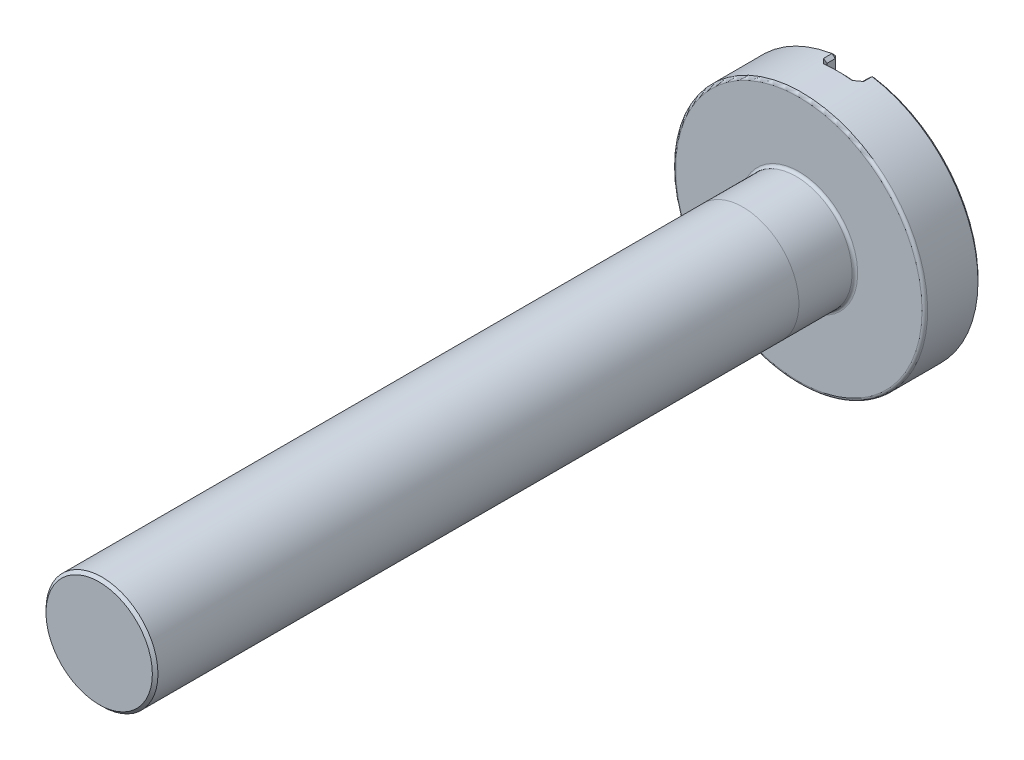
ISO-10303-21;
HEADER;
FILE_DESCRIPTION(('STEP AP214'),'2;1');
FILE_NAME('part.step','',(''),(''),'','','');
FILE_SCHEMA(('AUTOMOTIVE_DESIGN { 1 0 10303 214 1 1 1 1 }'));
ENDSEC;
DATA;
#1=APPLICATION_CONTEXT('core data for automotive mechanical design processes');
#2=APPLICATION_PROTOCOL_DEFINITION('international standard','automotive_design',2000,#1);
#3=PRODUCT_CONTEXT('',#1,'mechanical');
#4=PRODUCT('Part','Part','',(#3));
#5=PRODUCT_RELATED_PRODUCT_CATEGORY('part','',(#4));
#6=PRODUCT_DEFINITION_FORMATION('','',#4);
#7=PRODUCT_DEFINITION_CONTEXT('part definition',#1,'design');
#8=PRODUCT_DEFINITION('design','',#6,#7);
#9=PRODUCT_DEFINITION_SHAPE('','',#8);
#10=(LENGTH_UNIT() NAMED_UNIT(*) SI_UNIT(.MILLI.,.METRE.));
#11=(NAMED_UNIT(*) PLANE_ANGLE_UNIT() SI_UNIT($,.RADIAN.));
#12=(NAMED_UNIT(*) SI_UNIT($,.STERADIAN.) SOLID_ANGLE_UNIT());
#13=UNCERTAINTY_MEASURE_WITH_UNIT(LENGTH_MEASURE(1.E-05),#10,'distance_accuracy_value','');
#14=(GEOMETRIC_REPRESENTATION_CONTEXT(3) GLOBAL_UNCERTAINTY_ASSIGNED_CONTEXT((#13)) GLOBAL_UNIT_ASSIGNED_CONTEXT((#10,
#11,#12)) REPRESENTATION_CONTEXT('',''));
#15=CARTESIAN_POINT('',(0.,0.,0.));
#16=DIRECTION('',(0.,0.,1.));
#17=DIRECTION('',(1.,0.,0.));
#18=AXIS2_PLACEMENT_3D('',#15,#16,#17);
#19=CARTESIAN_POINT('',(0.,0.,125.));
#20=DIRECTION('',(0.,0.,-1.));
#21=DIRECTION('',(-1.,0.,0.));
#22=AXIS2_PLACEMENT_3D('',#19,#20,#21);
#23=CYLINDRICAL_SURFACE('',#22,10.);
#24=CARTESIAN_POINT('',(0.,0.,124.5));
#25=DIRECTION('',(0.,0.,1.));
#26=DIRECTION('',(1.,0.,0.));
#27=AXIS2_PLACEMENT_3D('',#24,#25,#26);
#28=CIRCLE('',#27,10.);
#29=CARTESIAN_POINT('',(10.,0.,124.5));
#30=VERTEX_POINT('',#29);
#31=EDGE_CURVE('E59',#30,#30,#28,.F.);
#32=ORIENTED_EDGE('',*,*,#31,.T.);
#33=EDGE_LOOP('',(#32));
#34=FACE_BOUND('',#33,.T.);
#35=CARTESIAN_POINT('',(0.,0.,9.99999999999999));
#36=DIRECTION('',(0.,0.,-1.));
#37=DIRECTION('',(-1.,0.,0.));
#38=AXIS2_PLACEMENT_3D('',#35,#36,#37);
#39=CIRCLE('',#38,10.);
#40=CARTESIAN_POINT('',(-10.,0.,10.));
#41=VERTEX_POINT('',#40);
#42=EDGE_CURVE('E11',#41,#41,#39,.T.);
#43=ORIENTED_EDGE('',*,*,#42,.F.);
#44=EDGE_LOOP('',(#43));
#45=FACE_BOUND('',#44,.T.);
#46=ADVANCED_FACE('F49',(#34,#45),#23,.T.);
#47=CARTESIAN_POINT('',(0.,0.,-10.));
#48=DIRECTION('',(0.,0.,1.));
#49=DIRECTION('',(1.,0.,0.));
#50=AXIS2_PLACEMENT_3D('',#47,#48,#49);
#51=CYLINDRICAL_SURFACE('',#50,22.5);
#52=CARTESIAN_POINT('',(0.,0.,-0.5));
#53=DIRECTION('',(0.,0.,-1.));
#54=DIRECTION('',(-1.,0.,0.));
#55=AXIS2_PLACEMENT_3D('',#52,#53,#54);
#56=CIRCLE('',#55,22.5);
#57=CARTESIAN_POINT('',(-22.5,0.,-0.5));
#58=VERTEX_POINT('',#57);
#59=EDGE_CURVE('E215',#58,#58,#56,.T.);
#60=ORIENTED_EDGE('',*,*,#59,.T.);
#61=EDGE_LOOP('',(#60));
#62=FACE_BOUND('',#61,.T.);
#63=CARTESIAN_POINT('',(3.57954545454546,-22.2134385978138,-8.));
#64=CARTESIAN_POINT('',(3.49044313577254,-22.2277959220937,-7.91081725524473));
#65=CARTESIAN_POINT('',(3.40106008970911,-22.2416500607058,-7.82183310951024));
#66=CARTESIAN_POINT('',(3.22168315908927,-22.2683406364463,-7.64432903282822));
#67=CARTESIAN_POINT('',(3.13168927393446,-22.2811770725775,-7.55580910233561));
#68=CARTESIAN_POINT('',(2.88093679969333,-22.3153844989665,-7.31080236996562));
#69=CARTESIAN_POINT('',(2.71946710818321,-22.3356468320787,-7.15488807871374));
#70=CARTESIAN_POINT('',(2.55681818181818,-22.3542541988124,-7.));
#71=B_SPLINE_CURVE_WITH_KNOTS('',3,(#63,#64,#65,#66,#67,#68,#69,#70),.UNSPECIFIED.,.F.,.F.,(4,2,
2,4),(0.,0.380643972705646,0.76128831836308,1.43736873556686),.UNSPECIFIED.);
#72=CARTESIAN_POINT('',(3.57954545454546,-22.2134385978138,-8.));
#73=VERTEX_POINT('',#72);
#74=CARTESIAN_POINT('',(2.55681818181818,-22.3542541988124,-7.));
#75=VERTEX_POINT('',#74);
#76=EDGE_CURVE('E345',#73,#75,#71,.T.);
#77=ORIENTED_EDGE('',*,*,#76,.F.);
#78=DIRECTION('',(0.,0.,1.));
#79=VECTOR('',#78,1.);
#80=CARTESIAN_POINT('',(3.57954545454546,-22.2134385978138,-10.));
#81=LINE('',#80,#79);
#82=CARTESIAN_POINT('',(3.57954545454546,-22.2134385978138,-9.5));
#83=VERTEX_POINT('',#82);
#84=EDGE_CURVE('E355',#73,#83,#81,.F.);
#85=ORIENTED_EDGE('',*,*,#84,.T.);
#86=CARTESIAN_POINT('',(0.,0.,-9.5));
#87=DIRECTION('',(0.,0.,-1.));
#88=DIRECTION('',(-1.,0.,0.));
#89=AXIS2_PLACEMENT_3D('',#86,#87,#88);
#90=CIRCLE('',#89,22.5);
#91=CARTESIAN_POINT('',(3.57954545454546,22.2134385978138,-9.5));
#92=VERTEX_POINT('',#91);
#93=EDGE_CURVE('E991',#83,#92,#90,.F.);
#94=ORIENTED_EDGE('',*,*,#93,.T.);
#95=DIRECTION('',(0.,0.,1.));
#96=VECTOR('',#95,1.);
#97=CARTESIAN_POINT('',(3.57954545454546,22.2134385978138,-10.));
#98=LINE('',#97,#96);
#99=CARTESIAN_POINT('',(3.57954545454546,22.2134385978138,-8.));
#100=VERTEX_POINT('',#99);
#101=EDGE_CURVE('E315',#92,#100,#98,.T.);
#102=ORIENTED_EDGE('',*,*,#101,.T.);
#103=CARTESIAN_POINT('',(2.55681818181818,22.3542541988124,-7.));
#104=CARTESIAN_POINT('',(2.64839427943384,22.3437790052845,-7.0871979694395));
#105=CARTESIAN_POINT('',(2.73959417329936,22.3327784719102,-7.17472569925024));
#106=CARTESIAN_POINT('',(2.92129371731404,22.309738799071,-7.35036917762152));
#107=CARTESIAN_POINT('',(3.01179336862716,22.297699661333,-7.43848492520419));
#108=CARTESIAN_POINT('',(3.26213414849512,22.2628523492319,-7.68382417251602));
#109=CARTESIAN_POINT('',(3.42127740145585,22.2389382114136,-7.84160444996238));
#110=CARTESIAN_POINT('',(3.57954545454546,22.2134385978138,-8.));
#111=B_SPLINE_CURVE_WITH_KNOTS('',3,(#103,#104,#105,#106,#107,#108,#109,#110),.UNSPECIFIED.,.F.,
.F.,(4,2,2,4),(0.,0.380645508799851,0.761290384745394,1.43736997086085),.UNSPECIFIED.);
#112=CARTESIAN_POINT('',(2.55681818181818,22.3542541988124,-7.));
#113=VERTEX_POINT('',#112);
#114=EDGE_CURVE('E307',#113,#100,#111,.T.);
#115=ORIENTED_EDGE('',*,*,#114,.F.);
#116=CARTESIAN_POINT('',(0.,0.,-7.));
#117=DIRECTION('',(0.,0.,1.));
#118=DIRECTION('',(1.,0.,0.));
#119=AXIS2_PLACEMENT_3D('',#116,#117,#118);
#120=CIRCLE('',#119,22.5);
#121=CARTESIAN_POINT('',(-2.55681818181818,22.3542541988124,-7.));
#122=VERTEX_POINT('',#121);
#123=EDGE_CURVE('E292',#113,#122,#120,.T.);
#124=ORIENTED_EDGE('',*,*,#123,.T.);
#125=CARTESIAN_POINT('',(-3.57954545454546,22.2134385978138,-8.));
#126=CARTESIAN_POINT('',(-3.49044313577254,22.2277959220937,-7.91081725524473));
#127=CARTESIAN_POINT('',(-3.4010600897091,22.2416500607058,-7.82183310951024));
#128=CARTESIAN_POINT('',(-3.22168315908927,22.2683406364463,-7.64432903282822));
#129=CARTESIAN_POINT('',(-3.13168927393446,22.2811770725775,-7.55580910233561));
#130=CARTESIAN_POINT('',(-2.88093679969333,22.3153844989665,-7.31080236996562));
#131=CARTESIAN_POINT('',(-2.7194671081832,22.3356468320787,-7.15488807871374));
#132=CARTESIAN_POINT('',(-2.55681818181818,22.3542541988124,-7.));
#133=B_SPLINE_CURVE_WITH_KNOTS('',3,(#125,#126,#127,#128,#129,#130,#131,#132),.UNSPECIFIED.,.F.,
.F.,(4,2,2,4),(0.,0.380643972705646,0.76128831836308,1.43736873556686),.UNSPECIFIED.);
#134=CARTESIAN_POINT('',(-3.57954545454546,22.2134385978138,-8.));
#135=VERTEX_POINT('',#134);
#136=EDGE_CURVE('E160',#135,#122,#133,.T.);
#137=ORIENTED_EDGE('',*,*,#136,.F.);
#138=DIRECTION('',(0.,0.,1.));
#139=VECTOR('',#138,1.);
#140=CARTESIAN_POINT('',(-3.57954545454546,22.2134385978138,-10.));
#141=LINE('',#140,#139);
#142=CARTESIAN_POINT('',(-3.57954545454546,22.2134385978138,-9.5));
#143=VERTEX_POINT('',#142);
#144=EDGE_CURVE('E154',#135,#143,#141,.F.);
#145=ORIENTED_EDGE('',*,*,#144,.T.);
#146=CARTESIAN_POINT('',(0.,0.,-9.5));
#147=DIRECTION('',(0.,0.,-1.));
#148=DIRECTION('',(-1.,0.,0.));
#149=AXIS2_PLACEMENT_3D('',#146,#147,#148);
#150=CIRCLE('',#149,22.5);
#151=CARTESIAN_POINT('',(-3.57954545454546,-22.2134385978138,-9.5));
#152=VERTEX_POINT('',#151);
#153=EDGE_CURVE('E157',#143,#152,#150,.F.);
#154=ORIENTED_EDGE('',*,*,#153,.T.);
#155=DIRECTION('',(0.,0.,1.));
#156=VECTOR('',#155,1.);
#157=CARTESIAN_POINT('',(-3.57954545454546,-22.2134385978138,-10.));
#158=LINE('',#157,#156);
#159=CARTESIAN_POINT('',(-3.57954545454546,-22.2134385978138,-8.));
#160=VERTEX_POINT('',#159);
#161=EDGE_CURVE('E166',#152,#160,#158,.T.);
#162=ORIENTED_EDGE('',*,*,#161,.T.);
#163=CARTESIAN_POINT('',(-2.55681818181818,-22.3542541988124,-7.));
#164=CARTESIAN_POINT('',(-2.64839427943384,-22.3437790052845,-7.0871979694395));
#165=CARTESIAN_POINT('',(-2.73959417329936,-22.3327784719102,-7.17472569925024));
#166=CARTESIAN_POINT('',(-2.92129371731404,-22.309738799071,-7.35036917762152));
#167=CARTESIAN_POINT('',(-3.01179336862716,-22.297699661333,-7.43848492520419));
#168=CARTESIAN_POINT('',(-3.26213414849511,-22.2628523492319,-7.68382417251602));
#169=CARTESIAN_POINT('',(-3.42127740145584,-22.2389382114136,-7.84160444996239));
#170=CARTESIAN_POINT('',(-3.57954545454546,-22.2134385978138,-8.));
#171=B_SPLINE_CURVE_WITH_KNOTS('',3,(#163,#164,#165,#166,#167,#168,#169,#170),.UNSPECIFIED.,.F.,
.F.,(4,2,2,4),(0.,0.38064550879985,0.761290384745394,1.43736997086085),.UNSPECIFIED.);
#172=CARTESIAN_POINT('',(-2.55681818181818,-22.3542541988124,-7.));
#173=VERTEX_POINT('',#172);
#174=EDGE_CURVE('E301',#173,#160,#171,.T.);
#175=ORIENTED_EDGE('',*,*,#174,.F.);
#176=CARTESIAN_POINT('',(0.,0.,-7.));
#177=DIRECTION('',(0.,0.,1.));
#178=DIRECTION('',(1.,0.,0.));
#179=AXIS2_PLACEMENT_3D('',#176,#177,#178);
#180=CIRCLE('',#179,22.5);
#181=EDGE_CURVE('E544',#173,#75,#180,.T.);
#182=ORIENTED_EDGE('',*,*,#181,.T.);
#183=EDGE_LOOP('',(#77,#85,#94,#102,#115,#124,#137,#145,#154,#162,#175,#182));
#184=FACE_BOUND('',#183,.T.);
#185=ADVANCED_FACE('F156',(#62,#184),#51,.T.);
#186=CARTESIAN_POINT('',(0.,0.,-10.));
#187=DIRECTION('',(0.,0.,-1.));
#188=DIRECTION('',(-1.,0.,0.));
#189=AXIS2_PLACEMENT_3D('',#186,#187,#188);
#190=PLANE('',#189);
#191=DIRECTION('',(0.,-1.,0.));
#192=VECTOR('',#191,1.);
#193=CARTESIAN_POINT('',(-3.49999999999999,-22.2991031209778,-10.));
#194=LINE('',#193,#192);
#195=CARTESIAN_POINT('',(-3.49999999999999,21.7198066289735,-10.));
#196=VERTEX_POINT('',#195);
#197=CARTESIAN_POINT('',(-3.49999999999999,-21.7198066289735,-10.));
#198=VERTEX_POINT('',#197);
#199=EDGE_CURVE('E65',#196,#198,#194,.T.);
#200=ORIENTED_EDGE('',*,*,#199,.T.);
#201=CARTESIAN_POINT('',(0.,0.,-10.));
#202=DIRECTION('',(0.,0.,-1.));
#203=DIRECTION('',(-1.,0.,0.));
#204=AXIS2_PLACEMENT_3D('',#201,#202,#203);
#205=CIRCLE('',#204,22.);
#206=EDGE_CURVE('E220',#198,#196,#205,.T.);
#207=ORIENTED_EDGE('',*,*,#206,.T.);
#208=EDGE_LOOP('',(#200,#207));
#209=FACE_BOUND('',#208,.T.);
#210=ADVANCED_FACE('F258',(#209),#190,.T.);
#211=ORIENTED_EDGE('',*,*,#42,.T.);
#212=EDGE_LOOP('',(#211));
#213=FACE_BOUND('',#212,.T.);
#214=CARTESIAN_POINT('',(0.,0.,0.5));
#215=DIRECTION('',(0.,0.,-1.));
#216=DIRECTION('',(-1.,0.,0.));
#217=AXIS2_PLACEMENT_3D('',#214,#215,#216);
#218=CIRCLE('',#217,10.);
#219=CARTESIAN_POINT('',(-10.,0.,0.5));
#220=VERTEX_POINT('',#219);
#221=EDGE_CURVE('E228',#220,#220,#218,.F.);
#222=ORIENTED_EDGE('',*,*,#221,.T.);
#223=EDGE_LOOP('',(#222));
#224=FACE_BOUND('',#223,.T.);
#225=ADVANCED_FACE('F249',(#213,#224),#23,.T.);
#226=CARTESIAN_POINT('',(0.,0.,125.));
#227=DIRECTION('',(0.,0.,1.));
#228=DIRECTION('',(1.,0.,0.));
#229=AXIS2_PLACEMENT_3D('',#226,#227,#228);
#230=PLANE('',#229);
#231=CARTESIAN_POINT('',(0.,0.,125.));
#232=DIRECTION('',(0.,0.,1.));
#233=DIRECTION('',(1.,0.,0.));
#234=AXIS2_PLACEMENT_3D('',#231,#232,#233);
#235=CIRCLE('',#234,9.50000000000001);
#236=CARTESIAN_POINT('',(9.50000000000001,0.,125.));
#237=VERTEX_POINT('',#236);
#238=EDGE_CURVE('E232',#237,#237,#235,.T.);
#239=ORIENTED_EDGE('',*,*,#238,.T.);
#240=EDGE_LOOP('',(#239));
#241=FACE_BOUND('',#240,.T.);
#242=ADVANCED_FACE('F246',(#241),#230,.T.);
#243=DIRECTION('',(0.,1.,0.));
#244=VECTOR('',#243,1.);
#245=CARTESIAN_POINT('',(3.49999999999999,22.2991031209778,-10.));
#246=LINE('',#245,#244);
#247=CARTESIAN_POINT('',(3.49999999999999,-21.7198066289735,-10.));
#248=VERTEX_POINT('',#247);
#249=CARTESIAN_POINT('',(3.49999999999999,21.7198066289735,-10.));
#250=VERTEX_POINT('',#249);
#251=EDGE_CURVE('E393',#248,#250,#246,.T.);
#252=ORIENTED_EDGE('',*,*,#251,.T.);
#253=CARTESIAN_POINT('',(0.,0.,-10.));
#254=DIRECTION('',(0.,0.,-1.));
#255=DIRECTION('',(-1.,0.,0.));
#256=AXIS2_PLACEMENT_3D('',#253,#254,#255);
#257=CIRCLE('',#256,22.);
#258=EDGE_CURVE('E396',#250,#248,#257,.T.);
#259=ORIENTED_EDGE('',*,*,#258,.T.);
#260=EDGE_LOOP('',(#252,#259));
#261=FACE_BOUND('',#260,.T.);
#262=ADVANCED_FACE('F248',(#261),#190,.T.);
#263=CARTESIAN_POINT('',(0.,0.,0.));
#264=DIRECTION('',(0.,0.,-1.));
#265=DIRECTION('',(-1.,0.,0.));
#266=AXIS2_PLACEMENT_3D('',#263,#264,#265);
#267=PLANE('',#266);
#268=CARTESIAN_POINT('',(0.,0.,0.));
#269=DIRECTION('',(0.,0.,-1.));
#270=DIRECTION('',(-1.,0.,0.));
#271=AXIS2_PLACEMENT_3D('',#268,#269,#270);
#272=CIRCLE('',#271,22.);
#273=CARTESIAN_POINT('',(-22.,0.,0.));
#274=VERTEX_POINT('',#273);
#275=EDGE_CURVE('E224',#274,#274,#272,.F.);
#276=ORIENTED_EDGE('',*,*,#275,.T.);
#277=EDGE_LOOP('',(#276));
#278=FACE_BOUND('',#277,.T.);
#279=CARTESIAN_POINT('',(0.,0.,0.));
#280=DIRECTION('',(0.,0.,-1.));
#281=DIRECTION('',(-1.,0.,0.));
#282=AXIS2_PLACEMENT_3D('',#279,#280,#281);
#283=CIRCLE('',#282,10.5);
#284=CARTESIAN_POINT('',(-10.5,0.,0.));
#285=VERTEX_POINT('',#284);
#286=EDGE_CURVE('E219',#285,#285,#283,.T.);
#287=ORIENTED_EDGE('',*,*,#286,.T.);
#288=EDGE_LOOP('',(#287));
#289=FACE_BOUND('',#288,.T.);
#290=ADVANCED_FACE('F255',(#278,#289),#267,.F.);
#291=CARTESIAN_POINT('',(0.,0.,-7.5));
#292=DIRECTION('',(0.,0.,1.));
#293=DIRECTION('',(1.,0.,0.));
#294=AXIS2_PLACEMENT_3D('',#291,#292,#293);
#295=PLANE('',#294);
#296=DIRECTION('',(0.,1.,0.));
#297=VECTOR('',#296,1.);
#298=CARTESIAN_POINT('',(-2.5,22.2991031209778,-7.5));
#299=LINE('',#298,#297);
#300=CARTESIAN_POINT('',(-2.5,-21.8574929943944,-7.5));
#301=VERTEX_POINT('',#300);
#302=CARTESIAN_POINT('',(-2.5,21.8574929943944,-7.5));
#303=VERTEX_POINT('',#302);
#304=EDGE_CURVE('E386',#301,#303,#299,.T.);
#305=ORIENTED_EDGE('',*,*,#304,.T.);
#306=CARTESIAN_POINT('',(0.,0.,-7.5));
#307=DIRECTION('',(0.,0.,1.));
#308=DIRECTION('',(1.,0.,0.));
#309=AXIS2_PLACEMENT_3D('',#306,#307,#308);
#310=CIRCLE('',#309,22.);
#311=CARTESIAN_POINT('',(2.5,21.8574929943944,-7.5));
#312=VERTEX_POINT('',#311);
#313=EDGE_CURVE('E389',#303,#312,#310,.F.);
#314=ORIENTED_EDGE('',*,*,#313,.T.);
#315=DIRECTION('',(0.,-1.,0.));
#316=VECTOR('',#315,1.);
#317=CARTESIAN_POINT('',(2.5,-22.2991031209778,-7.5));
#318=LINE('',#317,#316);
#319=CARTESIAN_POINT('',(2.5,-21.8574929943944,-7.5));
#320=VERTEX_POINT('',#319);
#321=EDGE_CURVE('E380',#312,#320,#318,.T.);
#322=ORIENTED_EDGE('',*,*,#321,.T.);
#323=CARTESIAN_POINT('',(0.,0.,-7.5));
#324=DIRECTION('',(0.,0.,1.));
#325=DIRECTION('',(1.,0.,0.));
#326=AXIS2_PLACEMENT_3D('',#323,#324,#325);
#327=CIRCLE('',#326,22.);
#328=EDGE_CURVE('E383',#320,#301,#327,.F.);
#329=ORIENTED_EDGE('',*,*,#328,.T.);
#330=EDGE_LOOP('',(#305,#314,#322,#329));
#331=FACE_BOUND('',#330,.T.);
#332=ADVANCED_FACE('F555',(#331),#295,.F.);
#333=CARTESIAN_POINT('',(-3.,-35.,-7.5));
#334=DIRECTION('',(-1.,0.,0.));
#335=DIRECTION('',(0.,0.,1.));
#336=AXIS2_PLACEMENT_3D('',#333,#334,#335);
#337=PLANE('',#336);
#338=DIRECTION('',(0.,0.,1.));
#339=VECTOR('',#338,1.);
#340=CARTESIAN_POINT('',(-3.,21.7198066289735,-7.5));
#341=LINE('',#340,#339);
#342=CARTESIAN_POINT('',(-3.,21.7198066289735,-9.5));
#343=VERTEX_POINT('',#342);
#344=CARTESIAN_POINT('',(-3.,21.7198066289735,-8.));
#345=VERTEX_POINT('',#344);
#346=EDGE_CURVE('E185',#343,#345,#341,.T.);
#347=ORIENTED_EDGE('',*,*,#346,.T.);
#348=DIRECTION('',(0.,-1.,0.));
#349=VECTOR('',#348,1.);
#350=CARTESIAN_POINT('',(-3.,-22.2991031209778,-8.));
#351=LINE('',#350,#349);
#352=CARTESIAN_POINT('',(-3.,-21.7198066289735,-8.));
#353=VERTEX_POINT('',#352);
#354=EDGE_CURVE('E377',#345,#353,#351,.T.);
#355=ORIENTED_EDGE('',*,*,#354,.T.);
#356=DIRECTION('',(0.,0.,-1.));
#357=VECTOR('',#356,1.);
#358=CARTESIAN_POINT('',(-3.,-21.7198066289735,-7.5));
#359=LINE('',#358,#357);
#360=CARTESIAN_POINT('',(-3.,-21.7198066289735,-9.5));
#361=VERTEX_POINT('',#360);
#362=EDGE_CURVE('E372',#353,#361,#359,.T.);
#363=ORIENTED_EDGE('',*,*,#362,.T.);
#364=DIRECTION('',(0.,1.,0.));
#365=VECTOR('',#364,1.);
#366=CARTESIAN_POINT('',(-3.,22.2991031209778,-9.5));
#367=LINE('',#366,#365);
#368=EDGE_CURVE('E369',#361,#343,#367,.T.);
#369=ORIENTED_EDGE('',*,*,#368,.T.);
#370=EDGE_LOOP('',(#347,#355,#363,#369));
#371=FACE_BOUND('',#370,.T.);
#372=ADVANCED_FACE('F585',(#371),#337,.F.);
#373=CARTESIAN_POINT('',(3.,-35.,-7.5));
#374=DIRECTION('',(1.,0.,0.));
#375=DIRECTION('',(0.,0.,-1.));
#376=AXIS2_PLACEMENT_3D('',#373,#374,#375);
#377=PLANE('',#376);
#378=DIRECTION('',(0.,0.,1.));
#379=VECTOR('',#378,1.);
#380=CARTESIAN_POINT('',(3.,-21.7198066289735,-7.5));
#381=LINE('',#380,#379);
#382=CARTESIAN_POINT('',(3.,-21.7198066289735,-9.5));
#383=VERTEX_POINT('',#382);
#384=CARTESIAN_POINT('',(3.,-21.7198066289735,-8.));
#385=VERTEX_POINT('',#384);
#386=EDGE_CURVE('E359',#383,#385,#381,.T.);
#387=ORIENTED_EDGE('',*,*,#386,.T.);
#388=DIRECTION('',(0.,1.,0.));
#389=VECTOR('',#388,1.);
#390=CARTESIAN_POINT('',(3.,22.2991031209778,-8.));
#391=LINE('',#390,#389);
#392=CARTESIAN_POINT('',(3.,21.7198066289735,-8.));
#393=VERTEX_POINT('',#392);
#394=EDGE_CURVE('E366',#385,#393,#391,.T.);
#395=ORIENTED_EDGE('',*,*,#394,.T.);
#396=DIRECTION('',(0.,0.,-1.));
#397=VECTOR('',#396,1.);
#398=CARTESIAN_POINT('',(3.,21.7198066289735,-7.5));
#399=LINE('',#398,#397);
#400=CARTESIAN_POINT('',(3.,21.7198066289735,-9.5));
#401=VERTEX_POINT('',#400);
#402=EDGE_CURVE('E362',#393,#401,#399,.T.);
#403=ORIENTED_EDGE('',*,*,#402,.T.);
#404=DIRECTION('',(0.,-1.,0.));
#405=VECTOR('',#404,1.);
#406=CARTESIAN_POINT('',(3.,-22.2991031209778,-9.5));
#407=LINE('',#406,#405);
#408=EDGE_CURVE('E354',#401,#383,#407,.T.);
#409=ORIENTED_EDGE('',*,*,#408,.T.);
#410=EDGE_LOOP('',(#387,#395,#403,#409));
#411=FACE_BOUND('',#410,.T.);
#412=ADVANCED_FACE('F596',(#411),#377,.F.);
#413=CARTESIAN_POINT('',(-3.,-21.7198066289735,-9.5));
#414=DIRECTION('',(0.544058820349427,-0.638748776906869,-0.544058820349389));
#415=DIRECTION('',(0.761278828383832,0.648424664440319,0.));
#416=AXIS2_PLACEMENT_3D('',#413,#414,#415);
#417=PLANE('',#416);
#418=DIRECTION('',(0.76127882838383,0.648424664440321,0.));
#419=VECTOR('',#418,1.);
#420=CARTESIAN_POINT('',(-3.,-21.7198066289735,-9.5));
#421=LINE('',#420,#419);
#422=EDGE_CURVE('E181',#152,#361,#421,.T.);
#423=ORIENTED_EDGE('',*,*,#422,.F.);
#424=DIRECTION('',(0.112494260643344,0.698101025154879,-0.707106781186557));
#425=VECTOR('',#424,1.);
#426=CARTESIAN_POINT('',(3.52978061381677E-13,-4.1441163445838E-13,-32.000000000001));
#427=LINE('',#426,#425);
#428=EDGE_CURVE('E173',#198,#152,#427,.F.);
#429=ORIENTED_EDGE('',*,*,#428,.F.);
#430=DIRECTION('',(0.707106781186538,0.,0.707106781186557));
#431=VECTOR('',#430,1.);
#432=CARTESIAN_POINT('',(-3.,-21.7198066289735,-9.5));
#433=LINE('',#432,#431);
#434=EDGE_CURVE('E210',#361,#198,#433,.F.);
#435=ORIENTED_EDGE('',*,*,#434,.F.);
#436=EDGE_LOOP('',(#423,#429,#435));
#437=FACE_BOUND('',#436,.T.);
#438=ADVANCED_FACE('F599',(#437),#417,.T.);
#439=CARTESIAN_POINT('',(0.,0.,-10.));
#440=DIRECTION('',(0.,0.,1.));
#441=DIRECTION('',(1.,0.,0.));
#442=AXIS2_PLACEMENT_3D('',#439,#440,#441);
#443=CONICAL_SURFACE('',#442,22.,0.785398163397435);
#444=ORIENTED_EDGE('',*,*,#428,.T.);
#445=ORIENTED_EDGE('',*,*,#153,.F.);
#446=DIRECTION('',(-0.112494260643344,0.698101025154879,0.707106781186557));
#447=VECTOR('',#446,1.);
#448=CARTESIAN_POINT('',(3.49202894949787E-13,4.09979424464173E-13,-32.000000000001));
#449=LINE('',#448,#447);
#450=EDGE_CURVE('E171',#196,#143,#449,.T.);
#451=ORIENTED_EDGE('',*,*,#450,.F.);
#452=ORIENTED_EDGE('',*,*,#206,.F.);
#453=EDGE_LOOP('',(#444,#445,#451,#452));
#454=FACE_BOUND('',#453,.T.);
#455=ADVANCED_FACE('F169',(#454),#443,.T.);
#456=CARTESIAN_POINT('',(-3.,-35.,-9.5));
#457=DIRECTION('',(0.707106781186557,0.,-0.707106781186538));
#458=DIRECTION('',(0.,-1.,0.));
#459=AXIS2_PLACEMENT_3D('',#456,#457,#458);
#460=PLANE('',#459);
#461=ORIENTED_EDGE('',*,*,#434,.T.);
#462=ORIENTED_EDGE('',*,*,#199,.F.);
#463=DIRECTION('',(-0.707106781186538,0.,-0.707106781186557));
#464=VECTOR('',#463,1.);
#465=CARTESIAN_POINT('',(-3.28977272727273,21.7198066289735,-9.78977272727274));
#466=LINE('',#465,#464);
#467=EDGE_CURVE('E73',#343,#196,#466,.T.);
#468=ORIENTED_EDGE('',*,*,#467,.F.);
#469=ORIENTED_EDGE('',*,*,#368,.F.);
#470=EDGE_LOOP('',(#461,#462,#468,#469));
#471=FACE_BOUND('',#470,.T.);
#472=ADVANCED_FACE('F588',(#471),#460,.T.);
#473=CARTESIAN_POINT('',(-3.57954545454545,-22.2134385978138,-10.));
#474=DIRECTION('',(-0.648424664440321,0.76127882838383,0.));
#475=DIRECTION('',(0.,0.,1.));
#476=AXIS2_PLACEMENT_3D('',#473,#474,#475);
#477=PLANE('',#476);
#478=ORIENTED_EDGE('',*,*,#422,.T.);
#479=ORIENTED_EDGE('',*,*,#362,.F.);
#480=DIRECTION('',(0.76127882838383,0.648424664440322,0.));
#481=VECTOR('',#480,1.);
#482=CARTESIAN_POINT('',(-3.57954545454546,-22.2134385978138,-8.));
#483=LINE('',#482,#481);
#484=EDGE_CURVE('E187',#160,#353,#483,.T.);
#485=ORIENTED_EDGE('',*,*,#484,.F.);
#486=ORIENTED_EDGE('',*,*,#161,.F.);
#487=EDGE_LOOP('',(#478,#479,#485,#486));
#488=FACE_BOUND('',#487,.T.);
#489=ADVANCED_FACE('F639',(#488),#477,.F.);
#490=CARTESIAN_POINT('',(-3.57954545454546,22.2134385978138,-9.5));
#491=DIRECTION('',(0.544058820349426,0.638748776906869,-0.544058820349389));
#492=DIRECTION('',(-0.761278828383832,0.648424664440319,0.));
#493=AXIS2_PLACEMENT_3D('',#490,#491,#492);
#494=PLANE('',#493);
#495=ORIENTED_EDGE('',*,*,#467,.T.);
#496=ORIENTED_EDGE('',*,*,#450,.T.);
#497=DIRECTION('',(0.76127882838383,-0.648424664440321,0.));
#498=VECTOR('',#497,1.);
#499=CARTESIAN_POINT('',(-3.57954545454546,22.2134385978138,-9.5));
#500=LINE('',#499,#498);
#501=EDGE_CURVE('E178',#343,#143,#500,.F.);
#502=ORIENTED_EDGE('',*,*,#501,.F.);
#503=EDGE_LOOP('',(#495,#496,#502));
#504=FACE_BOUND('',#503,.T.);
#505=ADVANCED_FACE('F177',(#504),#494,.T.);
#506=CARTESIAN_POINT('',(-2.5,-21.8574929943944,-7.5));
#507=CARTESIAN_POINT('',(-3.,-21.7198066289735,-8.));
#508=CARTESIAN_POINT('',(-2.55681818181818,-22.3542541988124,-7.));
#509=CARTESIAN_POINT('',(-3.57954545454546,-22.2134385978138,-8.));
#510=CARTESIAN_POINT('',(-2.55780939635301,-22.3629203847129,-6.99127731209346));
#511=CARTESIAN_POINT('',(-3.58965584280076,-22.2220501930235,-8.));
#512=B_SPLINE_SURFACE_WITH_KNOTS('',1,1,((#506,#507),(#508,#509),(#510,#511)),.UNSPECIFIED.,.F.,
.F.,.F.,(2,1,2),(2,2),(0.,1.,1.01744537581307),(0.,1.),.UNSPECIFIED.);
#513=CARTESIAN_POINT('',(-3.,-21.7198066289735,-8.));
#514=CARTESIAN_POINT('',(-2.95596818382361,-21.7319317904379,-7.95596818382361));
#515=CARTESIAN_POINT('',(-2.91193636764722,-21.7440569519023,-7.91193636764722));
#516=CARTESIAN_POINT('',(-2.84588864338263,-21.7622446940989,-7.84588864338263));
#517=CARTESIAN_POINT('',(-2.82387273529443,-21.7683072748312,-7.82387273529443));
#518=CARTESIAN_POINT('',(-2.77984091911804,-21.7804324362956,-7.77984091911804));
#519=CARTESIAN_POINT('',(-2.75782501102985,-21.7864950170278,-7.75782501102985));
#520=CARTESIAN_POINT('',(-2.71379319485345,-21.7986201784922,-7.71379319485346));
#521=CARTESIAN_POINT('',(-2.69177728676526,-21.8046827592244,-7.69177728676526));
#522=CARTESIAN_POINT('',(-2.64774547058887,-21.8168079206888,-7.64774547058887));
#523=CARTESIAN_POINT('',(-2.62572956250067,-21.822870501421,-7.62572956250067));
#524=CARTESIAN_POINT('',(-2.56914243627498,-21.8384530529003,-7.56914243627498));
#525=CARTESIAN_POINT('',(-2.53457121813749,-21.8479730236473,-7.53457121813749));
#526=CARTESIAN_POINT('',(-2.5,-21.8574929943944,-7.5));
#527=B_SPLINE_CURVE_WITH_KNOTS('',3,(#513,#514,#515,#516,#517,#518,#519,#520,#521,#522,#523,
#524,#525,#526),.UNSPECIFIED.,.F.,.F.,(4,2,2,2,2,2,4),(0.,0.190319707095958,0.285479560643938,
0.380639414191918,0.475799267739897,0.570959121287877,0.720387073192478),.UNSPECIFIED.);
#528=EDGE_CURVE('E188',#301,#353,#527,.F.);
#529=DIRECTION('',(-0.080353043316653,-0.702526432548805,0.707106781186548));
#530=VECTOR('',#529,1.);
#531=CARTESIAN_POINT('',(-2.5,-21.8574929943944,-7.5));
#532=LINE('',#531,#530);
#533=EDGE_CURVE('E195',#173,#301,#532,.F.);
#534=ORIENTED_EDGE('',*,*,#174,.T.);
#535=ORIENTED_EDGE('',*,*,#484,.T.);
#536=ORIENTED_EDGE('',*,*,#528,.F.);
#537=ORIENTED_EDGE('',*,*,#533,.F.);
#538=EDGE_LOOP('',(#534,#535,#536,#537));
#539=FACE_BOUND('',#538,.T.);
#540=ADVANCED_FACE('F548',(#539),#512,.T.);
#541=CARTESIAN_POINT('',(-3.57954545454545,22.2134385978138,-10.));
#542=DIRECTION('',(0.648424664440321,0.76127882838383,0.));
#543=DIRECTION('',(0.,0.,1.));
#544=AXIS2_PLACEMENT_3D('',#541,#542,#543);
#545=PLANE('',#544);
#546=ORIENTED_EDGE('',*,*,#501,.T.);
#547=ORIENTED_EDGE('',*,*,#144,.F.);
#548=DIRECTION('',(-0.76127882838383,0.648424664440322,0.));
#549=VECTOR('',#548,1.);
#550=CARTESIAN_POINT('',(-3.,21.7198066289735,-8.));
#551=LINE('',#550,#549);
#552=EDGE_CURVE('E526',#345,#135,#551,.T.);
#553=ORIENTED_EDGE('',*,*,#552,.F.);
#554=ORIENTED_EDGE('',*,*,#346,.F.);
#555=EDGE_LOOP('',(#546,#547,#553,#554));
#556=FACE_BOUND('',#555,.T.);
#557=ADVANCED_FACE('F183',(#556),#545,.T.);
#558=CARTESIAN_POINT('',(-2.5,0.,-7.5));
#559=DIRECTION('',(0.707106781186547,0.,-0.707106781186547));
#560=DIRECTION('',(0.,-1.,0.));
#561=AXIS2_PLACEMENT_3D('',#558,#559,#560);
#562=PLANE('',#561);
#563=ORIENTED_EDGE('',*,*,#528,.T.);
#564=ORIENTED_EDGE('',*,*,#354,.F.);
#565=CARTESIAN_POINT('',(-2.5,21.8574929943944,-7.5));
#566=CARTESIAN_POINT('',(-2.52201590808819,21.8514304136622,-7.52201590808819));
#567=CARTESIAN_POINT('',(-2.54403181617639,21.84536783293,-7.54403181617639));
#568=CARTESIAN_POINT('',(-2.58806363235278,21.8332426714656,-7.58806363235278));
#569=CARTESIAN_POINT('',(-2.61007954044098,21.8271800907333,-7.61007954044098));
#570=CARTESIAN_POINT('',(-2.65411135661737,21.8150549292689,-7.65411135661737));
#571=CARTESIAN_POINT('',(-2.67612726470557,21.8089923485367,-7.67612726470557));
#572=CARTESIAN_POINT('',(-2.72015908088196,21.7968671870723,-7.72015908088196));
#573=CARTESIAN_POINT('',(-2.74217498897015,21.7908046063401,-7.74217498897015));
#574=CARTESIAN_POINT('',(-2.78620680514654,21.7786794448757,-7.78620680514654));
#575=CARTESIAN_POINT('',(-2.80822271323474,21.7726168641435,-7.80822271323474));
#576=CARTESIAN_POINT('',(-2.88682574754862,21.750971731932,-7.88682574754863));
#577=CARTESIAN_POINT('',(-2.94341287377431,21.7353891804527,-7.94341287377431));
#578=CARTESIAN_POINT('',(-3.,21.7198066289735,-8.));
#579=B_SPLINE_CURVE_WITH_KNOTS('',3,(#565,#566,#567,#568,#569,#570,#571,#572,#573,#574,#575,
#576,#577,#578),.UNSPECIFIED.,.F.,.F.,(4,2,2,2,2,2,4),(0.,0.09515985354798,0.19031970709596,
0.285479560643941,0.380639414191921,0.4757992677399,0.720387073192478),.UNSPECIFIED.);
#580=EDGE_CURVE('E518',#303,#345,#579,.T.);
#581=ORIENTED_EDGE('',*,*,#580,.F.);
#582=ORIENTED_EDGE('',*,*,#304,.F.);
#583=EDGE_LOOP('',(#563,#564,#581,#582));
#584=FACE_BOUND('',#583,.T.);
#585=ADVANCED_FACE('F509',(#584),#562,.T.);
#586=CARTESIAN_POINT('',(0.,0.,-7.));
#587=DIRECTION('',(0.,0.,1.));
#588=DIRECTION('',(1.,0.,0.));
#589=AXIS2_PLACEMENT_3D('',#586,#587,#588);
#590=CONICAL_SURFACE('',#589,22.5,0.785398163397448);
#591=ORIENTED_EDGE('',*,*,#533,.T.);
#592=ORIENTED_EDGE('',*,*,#328,.F.);
#593=DIRECTION('',(-0.080353043316653,0.702526432548805,-0.707106781186548));
#594=VECTOR('',#593,1.);
#595=CARTESIAN_POINT('',(2.55681818181818,-22.3542541988124,-7.));
#596=LINE('',#595,#594);
#597=EDGE_CURVE('E527',#75,#320,#596,.T.);
#598=ORIENTED_EDGE('',*,*,#597,.F.);
#599=ORIENTED_EDGE('',*,*,#181,.F.);
#600=EDGE_LOOP('',(#591,#592,#598,#599));
#601=FACE_BOUND('',#600,.T.);
#602=ADVANCED_FACE('F541',(#601),#590,.T.);
#603=CARTESIAN_POINT('',(3.57954545454546,-22.2134385978138,-10.));
#604=DIRECTION('',(-0.648424664440321,-0.76127882838383,0.));
#605=DIRECTION('',(0.,0.,1.));
#606=AXIS2_PLACEMENT_3D('',#603,#604,#605);
#607=PLANE('',#606);
#608=DIRECTION('',(-0.76127882838383,0.648424664440321,0.));
#609=VECTOR('',#608,1.);
#610=CARTESIAN_POINT('',(3.57954545454546,-22.2134385978138,-9.5));
#611=LINE('',#610,#609);
#612=EDGE_CURVE('E531',#83,#383,#611,.T.);
#613=ORIENTED_EDGE('',*,*,#612,.F.);
#614=ORIENTED_EDGE('',*,*,#84,.F.);
#615=DIRECTION('',(0.76127882838383,-0.648424664440322,0.));
#616=VECTOR('',#615,1.);
#617=CARTESIAN_POINT('',(3.,-21.7198066289735,-8.));
#618=LINE('',#617,#616);
#619=EDGE_CURVE('E564',#385,#73,#618,.T.);
#620=ORIENTED_EDGE('',*,*,#619,.F.);
#621=ORIENTED_EDGE('',*,*,#386,.F.);
#622=EDGE_LOOP('',(#613,#614,#620,#621));
#623=FACE_BOUND('',#622,.T.);
#624=ADVANCED_FACE('F684',(#623),#607,.T.);
#625=CARTESIAN_POINT('',(3.57954545454546,-22.2134385978138,-9.5));
#626=DIRECTION('',(-0.544058820349426,-0.638748776906869,-0.544058820349389));
#627=DIRECTION('',(0.761278828383832,-0.648424664440319,0.));
#628=AXIS2_PLACEMENT_3D('',#625,#626,#627);
#629=PLANE('',#628);
#630=DIRECTION('',(0.112494260643344,-0.698101025154879,0.707106781186557));
#631=VECTOR('',#630,1.);
#632=CARTESIAN_POINT('',(-3.48259103341815E-13,-4.08871371965621E-13,-32.000000000001));
#633=LINE('',#632,#631);
#634=EDGE_CURVE('E570',#83,#248,#633,.F.);
#635=ORIENTED_EDGE('',*,*,#634,.F.);
#636=ORIENTED_EDGE('',*,*,#612,.T.);
#637=DIRECTION('',(0.707106781186538,0.,-0.707106781186557));
#638=VECTOR('',#637,1.);
#639=CARTESIAN_POINT('',(3.28977272727273,-21.7198066289735,-9.78977272727274));
#640=LINE('',#639,#638);
#641=EDGE_CURVE('E567',#248,#383,#640,.F.);
#642=ORIENTED_EDGE('',*,*,#641,.F.);
#643=EDGE_LOOP('',(#635,#636,#642));
#644=FACE_BOUND('',#643,.T.);
#645=ADVANCED_FACE('F690',(#644),#629,.T.);
#646=CARTESIAN_POINT('',(-3.,21.7198066289735,-8.));
#647=CARTESIAN_POINT('',(-2.5,21.8574929943944,-7.5));
#648=CARTESIAN_POINT('',(-3.57954545454546,22.2134385978138,-8.));
#649=CARTESIAN_POINT('',(-2.55681818181818,22.3542541988124,-7.));
#650=CARTESIAN_POINT('',(-3.5895451460666,22.2219559062918,-8.));
#651=CARTESIAN_POINT('',(-2.55779854373202,22.3628255002779,-6.99137281515823));
#652=B_SPLINE_SURFACE_WITH_KNOTS('',1,1,((#646,#647),(#648,#649),(#650,#651)),.UNSPECIFIED.,.F.,
.F.,.F.,(2,1,2),(2,2),(0.,1.,1.01725436968355),(0.,1.),.UNSPECIFIED.);
#653=DIRECTION('',(0.080353043316653,-0.702526432548805,-0.707106781186548));
#654=VECTOR('',#653,1.);
#655=CARTESIAN_POINT('',(-2.55681818181818,22.3542541988124,-7.));
#656=LINE('',#655,#654);
#657=EDGE_CURVE('E451',#303,#122,#656,.F.);
#658=ORIENTED_EDGE('',*,*,#552,.T.);
#659=ORIENTED_EDGE('',*,*,#136,.T.);
#660=ORIENTED_EDGE('',*,*,#657,.F.);
#661=ORIENTED_EDGE('',*,*,#580,.T.);
#662=EDGE_LOOP('',(#658,#659,#660,#661));
#663=FACE_BOUND('',#662,.T.);
#664=ADVANCED_FACE('F496',(#663),#652,.T.);
#665=CARTESIAN_POINT('',(3.,-21.7198066289735,-8.));
#666=CARTESIAN_POINT('',(2.5,-21.8574929943944,-7.5));
#667=CARTESIAN_POINT('',(3.57954545454546,-22.2134385978138,-8.));
#668=CARTESIAN_POINT('',(2.55681818181818,-22.3542541988124,-7.));
#669=CARTESIAN_POINT('',(3.58954514606661,-22.2219559062918,-8.));
#670=CARTESIAN_POINT('',(2.55779854373202,-22.3628255002779,-6.99137281515823));
#671=B_SPLINE_SURFACE_WITH_KNOTS('',1,1,((#665,#666),(#667,#668),(#669,#670)),.UNSPECIFIED.,.F.,
.F.,.F.,(2,1,2),(2,2),(0.,1.,1.01725436968355),(0.,1.),.UNSPECIFIED.);
#672=CARTESIAN_POINT('',(2.5,-21.8574929943944,-7.5));
#673=CARTESIAN_POINT('',(2.5220159080882,-21.8514304136622,-7.5220159080882));
#674=CARTESIAN_POINT('',(2.54403181617639,-21.84536783293,-7.54403181617639));
#675=CARTESIAN_POINT('',(2.58806363235278,-21.8332426714656,-7.58806363235278));
#676=CARTESIAN_POINT('',(2.61007954044098,-21.8271800907333,-7.61007954044098));
#677=CARTESIAN_POINT('',(2.65411135661737,-21.8150549292689,-7.65411135661737));
#678=CARTESIAN_POINT('',(2.67612726470557,-21.8089923485367,-7.67612726470557));
#679=CARTESIAN_POINT('',(2.72015908088196,-21.7968671870723,-7.72015908088196));
#680=CARTESIAN_POINT('',(2.74217498897015,-21.7908046063401,-7.74217498897015));
#681=CARTESIAN_POINT('',(2.78620680514655,-21.7786794448757,-7.78620680514654));
#682=CARTESIAN_POINT('',(2.80822271323474,-21.7726168641435,-7.80822271323474));
#683=CARTESIAN_POINT('',(2.88682574754863,-21.750971731932,-7.88682574754863));
#684=CARTESIAN_POINT('',(2.94341287377432,-21.7353891804527,-7.94341287377432));
#685=CARTESIAN_POINT('',(3.,-21.7198066289735,-8.));
#686=B_SPLINE_CURVE_WITH_KNOTS('',3,(#672,#673,#674,#675,#676,#677,#678,#679,#680,#681,#682,
#683,#684,#685),.UNSPECIFIED.,.F.,.F.,(4,2,2,2,2,2,4),(0.,0.0951598535479797,0.190319707095959,
0.285479560643939,0.380639414191919,0.475799267739899,0.720387073192478),.UNSPECIFIED.);
#687=EDGE_CURVE('E441',#385,#320,#686,.F.);
#688=ORIENTED_EDGE('',*,*,#76,.T.);
#689=ORIENTED_EDGE('',*,*,#597,.T.);
#690=ORIENTED_EDGE('',*,*,#687,.F.);
#691=ORIENTED_EDGE('',*,*,#619,.T.);
#692=EDGE_LOOP('',(#688,#689,#690,#691));
#693=FACE_BOUND('',#692,.T.);
#694=ADVANCED_FACE('F487',(#693),#671,.T.);
#695=CARTESIAN_POINT('',(3.,-35.,-9.5));
#696=DIRECTION('',(-0.707106781186557,0.,-0.707106781186538));
#697=DIRECTION('',(0.,1.,0.));
#698=AXIS2_PLACEMENT_3D('',#695,#696,#697);
#699=PLANE('',#698);
#700=ORIENTED_EDGE('',*,*,#641,.T.);
#701=ORIENTED_EDGE('',*,*,#408,.F.);
#702=DIRECTION('',(-0.707106781186538,0.,0.707106781186557));
#703=VECTOR('',#702,1.);
#704=CARTESIAN_POINT('',(3.,21.7198066289735,-9.5));
#705=LINE('',#704,#703);
#706=EDGE_CURVE('E452',#250,#401,#705,.T.);
#707=ORIENTED_EDGE('',*,*,#706,.F.);
#708=ORIENTED_EDGE('',*,*,#251,.F.);
#709=EDGE_LOOP('',(#700,#701,#707,#708));
#710=FACE_BOUND('',#709,.T.);
#711=ADVANCED_FACE('F480',(#710),#699,.T.);
#712=CARTESIAN_POINT('',(0.,0.,-10.));
#713=DIRECTION('',(0.,0.,1.));
#714=DIRECTION('',(1.,0.,0.));
#715=AXIS2_PLACEMENT_3D('',#712,#713,#714);
#716=CONICAL_SURFACE('',#715,22.,0.785398163397435);
#717=ORIENTED_EDGE('',*,*,#634,.T.);
#718=ORIENTED_EDGE('',*,*,#258,.F.);
#719=DIRECTION('',(-0.112494260643344,-0.698101025154879,-0.707106781186557));
#720=VECTOR('',#719,1.);
#721=CARTESIAN_POINT('',(-3.52034269773705E-13,4.13303581959828E-13,-32.000000000001));
#722=LINE('',#721,#720);
#723=EDGE_CURVE('E983',#92,#250,#722,.T.);
#724=ORIENTED_EDGE('',*,*,#723,.F.);
#725=ORIENTED_EDGE('',*,*,#93,.F.);
#726=EDGE_LOOP('',(#717,#718,#724,#725));
#727=FACE_BOUND('',#726,.T.);
#728=ADVANCED_FACE('F473',(#727),#716,.T.);
#729=CARTESIAN_POINT('',(0.,0.,-7.));
#730=DIRECTION('',(0.,0.,1.));
#731=DIRECTION('',(1.,0.,0.));
#732=AXIS2_PLACEMENT_3D('',#729,#730,#731);
#733=CONICAL_SURFACE('',#732,22.5,0.785398163397448);
#734=ORIENTED_EDGE('',*,*,#657,.T.);
#735=ORIENTED_EDGE('',*,*,#123,.F.);
#736=DIRECTION('',(0.080353043316653,0.702526432548805,0.707106781186548));
#737=VECTOR('',#736,1.);
#738=CARTESIAN_POINT('',(2.5,21.8574929943944,-7.5));
#739=LINE('',#738,#737);
#740=EDGE_CURVE('E418',#312,#113,#739,.T.);
#741=ORIENTED_EDGE('',*,*,#740,.F.);
#742=ORIENTED_EDGE('',*,*,#313,.F.);
#743=EDGE_LOOP('',(#734,#735,#741,#742));
#744=FACE_BOUND('',#743,.T.);
#745=ADVANCED_FACE('F433',(#744),#733,.T.);
#746=CARTESIAN_POINT('',(2.5,0.,-7.5));
#747=DIRECTION('',(-0.707106781186547,0.,-0.707106781186547));
#748=DIRECTION('',(0.,1.,0.));
#749=AXIS2_PLACEMENT_3D('',#746,#747,#748);
#750=PLANE('',#749);
#751=ORIENTED_EDGE('',*,*,#687,.T.);
#752=ORIENTED_EDGE('',*,*,#321,.F.);
#753=CARTESIAN_POINT('',(3.,21.7198066289735,-8.));
#754=CARTESIAN_POINT('',(2.95596818382361,21.7319317904379,-7.95596818382361));
#755=CARTESIAN_POINT('',(2.91193636764722,21.7440569519023,-7.91193636764722));
#756=CARTESIAN_POINT('',(2.84588864338263,21.7622446940989,-7.84588864338263));
#757=CARTESIAN_POINT('',(2.82387273529443,21.7683072748311,-7.82387273529443));
#758=CARTESIAN_POINT('',(2.77984091911804,21.7804324362956,-7.77984091911804));
#759=CARTESIAN_POINT('',(2.75782501102985,21.7864950170278,-7.75782501102985));
#760=CARTESIAN_POINT('',(2.71379319485346,21.7986201784922,-7.71379319485346));
#761=CARTESIAN_POINT('',(2.69177728676526,21.8046827592244,-7.69177728676526));
#762=CARTESIAN_POINT('',(2.64774547058887,21.8168079206888,-7.64774547058887));
#763=CARTESIAN_POINT('',(2.62572956250067,21.822870501421,-7.62572956250067));
#764=CARTESIAN_POINT('',(2.56914243627498,21.8384530529003,-7.56914243627499));
#765=CARTESIAN_POINT('',(2.53457121813749,21.8479730236474,-7.53457121813749));
#766=CARTESIAN_POINT('',(2.5,21.8574929943944,-7.5));
#767=B_SPLINE_CURVE_WITH_KNOTS('',3,(#753,#754,#755,#756,#757,#758,#759,#760,#761,#762,#763,
#764,#765,#766),.UNSPECIFIED.,.F.,.F.,(4,2,2,2,2,2,4),(0.,0.190319707095959,0.285479560643939,
0.380639414191918,0.475799267739898,0.570959121287879,0.720387073192478),.UNSPECIFIED.);
#768=EDGE_CURVE('E410',#393,#312,#767,.T.);
#769=ORIENTED_EDGE('',*,*,#768,.F.);
#770=ORIENTED_EDGE('',*,*,#394,.F.);
#771=EDGE_LOOP('',(#751,#752,#769,#770));
#772=FACE_BOUND('',#771,.T.);
#773=ADVANCED_FACE('F425',(#772),#750,.T.);
#774=CARTESIAN_POINT('',(3.,21.7198066289735,-9.5));
#775=DIRECTION('',(-0.544058820349427,0.638748776906869,-0.544058820349389));
#776=DIRECTION('',(-0.761278828383832,-0.648424664440319,0.));
#777=AXIS2_PLACEMENT_3D('',#774,#775,#776);
#778=PLANE('',#777);
#779=ORIENTED_EDGE('',*,*,#723,.T.);
#780=ORIENTED_EDGE('',*,*,#706,.T.);
#781=DIRECTION('',(-0.76127882838383,-0.648424664440321,0.));
#782=VECTOR('',#781,1.);
#783=CARTESIAN_POINT('',(3.,21.7198066289735,-9.5));
#784=LINE('',#783,#782);
#785=EDGE_CURVE('E407',#92,#401,#784,.T.);
#786=ORIENTED_EDGE('',*,*,#785,.F.);
#787=EDGE_LOOP('',(#779,#780,#786));
#788=FACE_BOUND('',#787,.T.);
#789=ADVANCED_FACE('F432',(#788),#778,.T.);
#790=CARTESIAN_POINT('',(2.5,21.8574929943944,-7.5));
#791=CARTESIAN_POINT('',(3.,21.7198066289735,-8.));
#792=CARTESIAN_POINT('',(2.55681818181818,22.3542541988124,-7.));
#793=CARTESIAN_POINT('',(3.57954545454546,22.2134385978138,-8.));
#794=CARTESIAN_POINT('',(2.55780939635302,22.3629203847129,-6.99127731209346));
#795=CARTESIAN_POINT('',(3.58965584280077,22.2220501930236,-8.));
#796=B_SPLINE_SURFACE_WITH_KNOTS('',1,1,((#790,#791),(#792,#793),(#794,#795)),.UNSPECIFIED.,.F.,
.F.,.F.,(2,1,2),(2,2),(0.,1.,1.01744537581308),(0.,1.),.UNSPECIFIED.);
#797=DIRECTION('',(-0.76127882838383,-0.648424664440322,0.));
#798=VECTOR('',#797,1.);
#799=CARTESIAN_POINT('',(3.57954545454546,22.2134385978138,-8.));
#800=LINE('',#799,#798);
#801=EDGE_CURVE('E404',#393,#100,#800,.F.);
#802=ORIENTED_EDGE('',*,*,#740,.T.);
#803=ORIENTED_EDGE('',*,*,#114,.T.);
#804=ORIENTED_EDGE('',*,*,#801,.F.);
#805=ORIENTED_EDGE('',*,*,#768,.T.);
#806=EDGE_LOOP('',(#802,#803,#804,#805));
#807=FACE_BOUND('',#806,.T.);
#808=ADVANCED_FACE('F435',(#807),#796,.T.);
#809=CARTESIAN_POINT('',(3.57954545454546,22.2134385978138,-10.));
#810=DIRECTION('',(0.648424664440321,-0.76127882838383,0.));
#811=DIRECTION('',(0.,0.,1.));
#812=AXIS2_PLACEMENT_3D('',#809,#810,#811);
#813=PLANE('',#812);
#814=ORIENTED_EDGE('',*,*,#785,.T.);
#815=ORIENTED_EDGE('',*,*,#402,.F.);
#816=ORIENTED_EDGE('',*,*,#801,.T.);
#817=ORIENTED_EDGE('',*,*,#101,.F.);
#818=EDGE_LOOP('',(#814,#815,#816,#817));
#819=FACE_BOUND('',#818,.T.);
#820=ADVANCED_FACE('F338',(#819),#813,.F.);
#821=CARTESIAN_POINT('',(0.,0.,-0.5));
#822=DIRECTION('',(0.,0.,-1.));
#823=DIRECTION('',(-1.,0.,0.));
#824=AXIS2_PLACEMENT_3D('',#821,#822,#823);
#825=TOROIDAL_SURFACE('',#824,22.,0.5);
#826=ORIENTED_EDGE('',*,*,#275,.F.);
#827=EDGE_LOOP('',(#826));
#828=FACE_BOUND('',#827,.T.);
#829=ORIENTED_EDGE('',*,*,#59,.F.);
#830=EDGE_LOOP('',(#829));
#831=FACE_BOUND('',#830,.T.);
#832=ADVANCED_FACE('F614',(#828,#831),#825,.T.);
#833=CARTESIAN_POINT('',(0.,0.,0.5));
#834=DIRECTION('',(0.,0.,-1.));
#835=DIRECTION('',(-1.,0.,0.));
#836=AXIS2_PLACEMENT_3D('',#833,#834,#835);
#837=TOROIDAL_SURFACE('',#836,10.5,0.5);
#838=ORIENTED_EDGE('',*,*,#286,.F.);
#839=EDGE_LOOP('',(#838));
#840=FACE_BOUND('',#839,.T.);
#841=ORIENTED_EDGE('',*,*,#221,.F.);
#842=EDGE_LOOP('',(#841));
#843=FACE_BOUND('',#842,.T.);
#844=ADVANCED_FACE('F243',(#840,#843),#837,.F.);
#845=CARTESIAN_POINT('',(0.,0.,125.));
#846=DIRECTION('',(0.,0.,-1.));
#847=DIRECTION('',(-1.,0.,0.));
#848=AXIS2_PLACEMENT_3D('',#845,#846,#847);
#849=CONICAL_SURFACE('',#848,9.50000000000001,0.785398163397455);
#850=ORIENTED_EDGE('',*,*,#31,.F.);
#851=EDGE_LOOP('',(#850));
#852=FACE_BOUND('',#851,.T.);
#853=ORIENTED_EDGE('',*,*,#238,.F.);
#854=EDGE_LOOP('',(#853));
#855=FACE_BOUND('',#854,.T.);
#856=ADVANCED_FACE('F52',(#852,#855),#849,.T.);
#857=CLOSED_SHELL('',(#46,#185,#210,#225,#242,#262,#290,#332,#372,#412,#438,#455,#472,#489,#505,
#540,#557,#585,#602,#624,#645,#664,#694,#711,#728,#745,#773,#789,#808,#820,#832,#844,#856));
#858=MANIFOLD_SOLID_BREP('B2',#857);
#859=ADVANCED_BREP_SHAPE_REPRESENTATION('',(#18,#858),#14);
#860=SHAPE_DEFINITION_REPRESENTATION(#9,#859);
ENDSEC;
END-ISO-10303-21;
